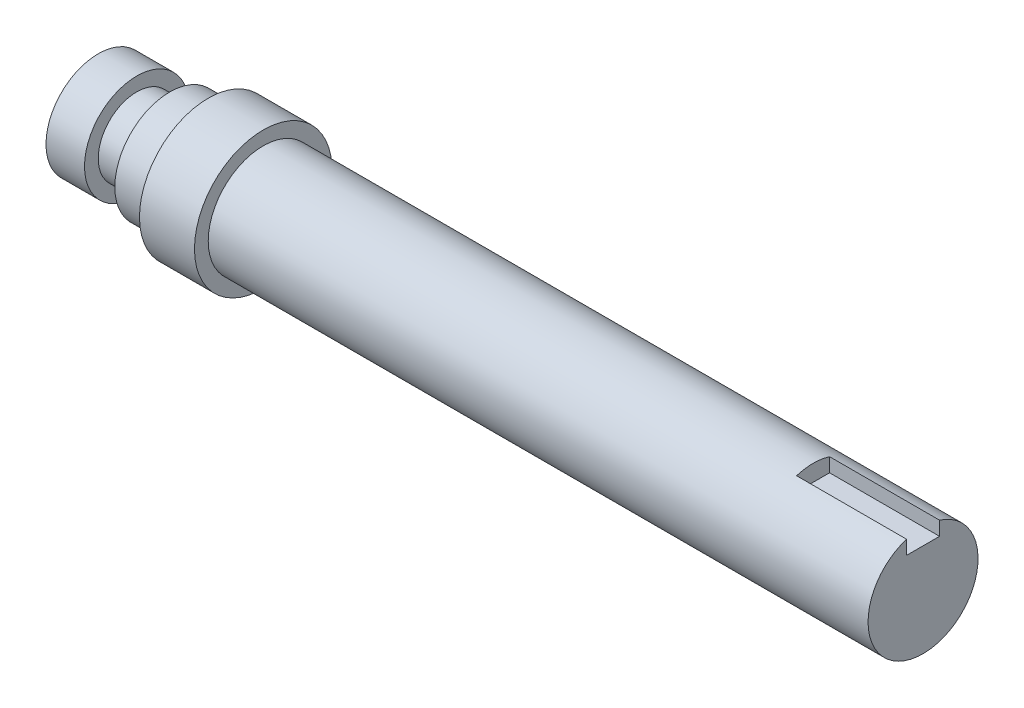
ISO-10303-21;
HEADER;
FILE_DESCRIPTION(('STEP AP214'),'2;1');
FILE_NAME('part.step','',(''),(''),'','','');
FILE_SCHEMA(('AUTOMOTIVE_DESIGN { 1 0 10303 214 1 1 1 1 }'));
ENDSEC;
DATA;
#1=APPLICATION_CONTEXT('core data for automotive mechanical design processes');
#2=APPLICATION_PROTOCOL_DEFINITION('international standard','automotive_design',2000,#1);
#3=PRODUCT_CONTEXT('',#1,'mechanical');
#4=PRODUCT('Part','Part','',(#3));
#5=PRODUCT_RELATED_PRODUCT_CATEGORY('part','',(#4));
#6=PRODUCT_DEFINITION_FORMATION('','',#4);
#7=PRODUCT_DEFINITION_CONTEXT('part definition',#1,'design');
#8=PRODUCT_DEFINITION('design','',#6,#7);
#9=PRODUCT_DEFINITION_SHAPE('','',#8);
#10=(LENGTH_UNIT() NAMED_UNIT(*) SI_UNIT(.MILLI.,.METRE.));
#11=(NAMED_UNIT(*) PLANE_ANGLE_UNIT() SI_UNIT($,.RADIAN.));
#12=(NAMED_UNIT(*) SI_UNIT($,.STERADIAN.) SOLID_ANGLE_UNIT());
#13=UNCERTAINTY_MEASURE_WITH_UNIT(LENGTH_MEASURE(1.E-05),#10,'distance_accuracy_value','');
#14=(GEOMETRIC_REPRESENTATION_CONTEXT(3) GLOBAL_UNCERTAINTY_ASSIGNED_CONTEXT((#13)) GLOBAL_UNIT_ASSIGNED_CONTEXT((#10,
#11,#12)) REPRESENTATION_CONTEXT('',''));
#15=CARTESIAN_POINT('',(0.,0.,0.));
#16=DIRECTION('',(0.,0.,1.));
#17=DIRECTION('',(1.,0.,0.));
#18=AXIS2_PLACEMENT_3D('',#15,#16,#17);
#19=CARTESIAN_POINT('',(0.,0.,0.));
#20=DIRECTION('',(-1.,0.,0.));
#21=DIRECTION('',(0.,0.,1.));
#22=AXIS2_PLACEMENT_3D('',#19,#20,#21);
#23=PLANE('',#22);
#24=CARTESIAN_POINT('',(0.,0.,0.));
#25=DIRECTION('',(-1.,0.,0.));
#26=DIRECTION('',(0.,0.,1.));
#27=AXIS2_PLACEMENT_3D('',#24,#25,#26);
#28=CIRCLE('',#27,10.);
#29=CARTESIAN_POINT('',(0.,9.53939201416945,-3.));
#30=VERTEX_POINT('',#29);
#31=CARTESIAN_POINT('',(0.,9.53939201416945,3.));
#32=VERTEX_POINT('',#31);
#33=EDGE_CURVE('E129',#30,#32,#28,.T.);
#34=ORIENTED_EDGE('',*,*,#33,.F.);
#35=DIRECTION('',(0.,1.,0.));
#36=VECTOR('',#35,1.);
#37=CARTESIAN_POINT('',(0.,12.,-3.));
#38=LINE('',#37,#36);
#39=CARTESIAN_POINT('',(0.,7.,-3.));
#40=VERTEX_POINT('',#39);
#41=EDGE_CURVE('E59',#40,#30,#38,.T.);
#42=ORIENTED_EDGE('',*,*,#41,.F.);
#43=DIRECTION('',(0.,0.,1.));
#44=VECTOR('',#43,1.);
#45=CARTESIAN_POINT('',(0.,7.,-3.));
#46=LINE('',#45,#44);
#47=CARTESIAN_POINT('',(0.,7.,3.));
#48=VERTEX_POINT('',#47);
#49=EDGE_CURVE('E89',#40,#48,#46,.T.);
#50=ORIENTED_EDGE('',*,*,#49,.T.);
#51=DIRECTION('',(0.,1.,0.));
#52=VECTOR('',#51,1.);
#53=CARTESIAN_POINT('',(0.,12.,3.));
#54=LINE('',#53,#52);
#55=EDGE_CURVE('E82',#48,#32,#54,.T.);
#56=ORIENTED_EDGE('',*,*,#55,.T.);
#57=EDGE_LOOP('',(#34,#42,#50,#56));
#58=FACE_BOUND('',#57,.T.);
#59=ADVANCED_FACE('F37',(#58),#23,.F.);
#60=CARTESIAN_POINT('',(-150.,0.,0.));
#61=DIRECTION('',(-1.,0.,0.));
#62=DIRECTION('',(0.,0.,1.));
#63=AXIS2_PLACEMENT_3D('',#60,#61,#62);
#64=CYLINDRICAL_SURFACE('',#63,9.99999999999999);
#65=CARTESIAN_POINT('',(-120.,0.,0.));
#66=DIRECTION('',(-1.,0.,0.));
#67=DIRECTION('',(0.,0.,1.));
#68=AXIS2_PLACEMENT_3D('',#65,#66,#67);
#69=CIRCLE('',#68,9.99999999999999);
#70=CARTESIAN_POINT('',(-120.,0.,9.99999999999999));
#71=VERTEX_POINT('',#70);
#72=EDGE_CURVE('E126',#71,#71,#69,.T.);
#73=ORIENTED_EDGE('',*,*,#72,.F.);
#74=EDGE_LOOP('',(#73));
#75=FACE_BOUND('',#74,.T.);
#76=CARTESIAN_POINT('',(-20.,0.,0.));
#77=DIRECTION('',(-1.,0.,0.));
#78=DIRECTION('',(0.,0.,1.));
#79=AXIS2_PLACEMENT_3D('',#76,#77,#78);
#80=CIRCLE('',#79,9.99999999999999);
#81=CARTESIAN_POINT('',(-20.,9.53939201416945,3.));
#82=VERTEX_POINT('',#81);
#83=CARTESIAN_POINT('',(-20.,9.53939201416945,-3.));
#84=VERTEX_POINT('',#83);
#85=EDGE_CURVE('E44',#82,#84,#80,.T.);
#86=ORIENTED_EDGE('',*,*,#85,.T.);
#87=DIRECTION('',(-1.,0.,0.));
#88=VECTOR('',#87,1.);
#89=CARTESIAN_POINT('',(-150.,9.53939201416945,-3.));
#90=LINE('',#89,#88);
#91=EDGE_CURVE('E11',#84,#30,#90,.F.);
#92=ORIENTED_EDGE('',*,*,#91,.T.);
#93=ORIENTED_EDGE('',*,*,#33,.T.);
#94=DIRECTION('',(-1.,0.,0.));
#95=VECTOR('',#94,1.);
#96=CARTESIAN_POINT('',(-150.,9.53939201416945,3.));
#97=LINE('',#96,#95);
#98=EDGE_CURVE('E132',#82,#32,#97,.F.);
#99=ORIENTED_EDGE('',*,*,#98,.F.);
#100=EDGE_LOOP('',(#86,#92,#93,#99));
#101=FACE_BOUND('',#100,.T.);
#102=ADVANCED_FACE('F135',(#75,#101),#64,.T.);
#103=CARTESIAN_POINT('',(-120.,9.99999999999999,0.));
#104=DIRECTION('',(-1.,0.,0.));
#105=DIRECTION('',(0.,0.,1.));
#106=AXIS2_PLACEMENT_3D('',#103,#104,#105);
#107=PLANE('',#106);
#108=CARTESIAN_POINT('',(-120.,0.,0.));
#109=DIRECTION('',(-1.,0.,0.));
#110=DIRECTION('',(0.,0.,1.));
#111=AXIS2_PLACEMENT_3D('',#108,#109,#110);
#112=CIRCLE('',#111,12.5);
#113=CARTESIAN_POINT('',(-120.,0.,12.5));
#114=VERTEX_POINT('',#113);
#115=EDGE_CURVE('E123',#114,#114,#112,.T.);
#116=ORIENTED_EDGE('',*,*,#115,.F.);
#117=EDGE_LOOP('',(#116));
#118=FACE_BOUND('',#117,.T.);
#119=ORIENTED_EDGE('',*,*,#72,.T.);
#120=EDGE_LOOP('',(#119));
#121=FACE_BOUND('',#120,.T.);
#122=ADVANCED_FACE('F143',(#118,#121),#107,.F.);
#123=CARTESIAN_POINT('',(-150.,0.,0.));
#124=DIRECTION('',(-1.,0.,0.));
#125=DIRECTION('',(0.,0.,1.));
#126=AXIS2_PLACEMENT_3D('',#123,#124,#125);
#127=CYLINDRICAL_SURFACE('',#126,12.5);
#128=CARTESIAN_POINT('',(-130.,0.,0.));
#129=DIRECTION('',(-1.,0.,0.));
#130=DIRECTION('',(0.,0.,1.));
#131=AXIS2_PLACEMENT_3D('',#128,#129,#130);
#132=CIRCLE('',#131,12.5);
#133=CARTESIAN_POINT('',(-130.,0.,12.5));
#134=VERTEX_POINT('',#133);
#135=EDGE_CURVE('E120',#134,#134,#132,.T.);
#136=ORIENTED_EDGE('',*,*,#135,.F.);
#137=EDGE_LOOP('',(#136));
#138=FACE_BOUND('',#137,.T.);
#139=ORIENTED_EDGE('',*,*,#115,.T.);
#140=EDGE_LOOP('',(#139));
#141=FACE_BOUND('',#140,.T.);
#142=ADVANCED_FACE('F148',(#138,#141),#127,.T.);
#143=CARTESIAN_POINT('',(-130.,12.5,0.));
#144=DIRECTION('',(1.,0.,0.));
#145=DIRECTION('',(0.,0.,-1.));
#146=AXIS2_PLACEMENT_3D('',#143,#144,#145);
#147=PLANE('',#146);
#148=CARTESIAN_POINT('',(-130.,0.,0.));
#149=DIRECTION('',(-1.,0.,0.));
#150=DIRECTION('',(0.,0.,1.));
#151=AXIS2_PLACEMENT_3D('',#148,#149,#150);
#152=CIRCLE('',#151,9.97959183673467);
#153=CARTESIAN_POINT('',(-130.,0.,9.97959183673467));
#154=VERTEX_POINT('',#153);
#155=EDGE_CURVE('E117',#154,#154,#152,.T.);
#156=ORIENTED_EDGE('',*,*,#155,.F.);
#157=EDGE_LOOP('',(#156));
#158=FACE_BOUND('',#157,.T.);
#159=ORIENTED_EDGE('',*,*,#135,.T.);
#160=EDGE_LOOP('',(#159));
#161=FACE_BOUND('',#160,.T.);
#162=ADVANCED_FACE('F155',(#158,#161),#147,.F.);
#163=CARTESIAN_POINT('',(-150.,0.,0.));
#164=DIRECTION('',(-1.,0.,0.));
#165=DIRECTION('',(0.,0.,1.));
#166=AXIS2_PLACEMENT_3D('',#163,#164,#165);
#167=CYLINDRICAL_SURFACE('',#166,9.97959183673467);
#168=CARTESIAN_POINT('',(-137.,0.,0.));
#169=DIRECTION('',(-1.,0.,0.));
#170=DIRECTION('',(0.,0.,1.));
#171=AXIS2_PLACEMENT_3D('',#168,#169,#170);
#172=CIRCLE('',#171,9.97959183673467);
#173=CARTESIAN_POINT('',(-137.,0.,9.97959183673467));
#174=VERTEX_POINT('',#173);
#175=EDGE_CURVE('E114',#174,#174,#172,.T.);
#176=ORIENTED_EDGE('',*,*,#175,.F.);
#177=EDGE_LOOP('',(#176));
#178=FACE_BOUND('',#177,.T.);
#179=ORIENTED_EDGE('',*,*,#155,.T.);
#180=EDGE_LOOP('',(#179));
#181=FACE_BOUND('',#180,.T.);
#182=ADVANCED_FACE('F159',(#178,#181),#167,.T.);
#183=CARTESIAN_POINT('',(-137.,9.97959183673467,0.));
#184=DIRECTION('',(1.,0.,0.));
#185=DIRECTION('',(0.,0.,-1.));
#186=AXIS2_PLACEMENT_3D('',#183,#184,#185);
#187=PLANE('',#186);
#188=CARTESIAN_POINT('',(-137.,0.,0.));
#189=DIRECTION('',(-1.,0.,0.));
#190=DIRECTION('',(0.,0.,1.));
#191=AXIS2_PLACEMENT_3D('',#188,#189,#190);
#192=CIRCLE('',#191,6.99999999999998);
#193=CARTESIAN_POINT('',(-137.,0.,6.99999999999998));
#194=VERTEX_POINT('',#193);
#195=EDGE_CURVE('E111',#194,#194,#192,.T.);
#196=ORIENTED_EDGE('',*,*,#195,.F.);
#197=EDGE_LOOP('',(#196));
#198=FACE_BOUND('',#197,.T.);
#199=ORIENTED_EDGE('',*,*,#175,.T.);
#200=EDGE_LOOP('',(#199));
#201=FACE_BOUND('',#200,.T.);
#202=ADVANCED_FACE('F163',(#198,#201),#187,.F.);
#203=CARTESIAN_POINT('',(-150.,0.,0.));
#204=DIRECTION('',(-1.,0.,0.));
#205=DIRECTION('',(0.,0.,1.));
#206=AXIS2_PLACEMENT_3D('',#203,#204,#205);
#207=CYLINDRICAL_SURFACE('',#206,6.99999999999998);
#208=CARTESIAN_POINT('',(-143.,0.,0.));
#209=DIRECTION('',(-1.,0.,0.));
#210=DIRECTION('',(0.,0.,1.));
#211=AXIS2_PLACEMENT_3D('',#208,#209,#210);
#212=CIRCLE('',#211,6.99999999999998);
#213=CARTESIAN_POINT('',(-143.,0.,6.99999999999998));
#214=VERTEX_POINT('',#213);
#215=EDGE_CURVE('E108',#214,#214,#212,.T.);
#216=ORIENTED_EDGE('',*,*,#215,.F.);
#217=EDGE_LOOP('',(#216));
#218=FACE_BOUND('',#217,.T.);
#219=ORIENTED_EDGE('',*,*,#195,.T.);
#220=EDGE_LOOP('',(#219));
#221=FACE_BOUND('',#220,.T.);
#222=ADVANCED_FACE('F167',(#218,#221),#207,.T.);
#223=CARTESIAN_POINT('',(-143.,6.99999999999998,0.));
#224=DIRECTION('',(-1.,0.,0.));
#225=DIRECTION('',(0.,0.,1.));
#226=AXIS2_PLACEMENT_3D('',#223,#224,#225);
#227=PLANE('',#226);
#228=CARTESIAN_POINT('',(-143.,0.,0.));
#229=DIRECTION('',(-1.,0.,0.));
#230=DIRECTION('',(0.,0.,1.));
#231=AXIS2_PLACEMENT_3D('',#228,#229,#230);
#232=CIRCLE('',#231,9.5);
#233=CARTESIAN_POINT('',(-143.,0.,9.5));
#234=VERTEX_POINT('',#233);
#235=EDGE_CURVE('E105',#234,#234,#232,.T.);
#236=ORIENTED_EDGE('',*,*,#235,.F.);
#237=EDGE_LOOP('',(#236));
#238=FACE_BOUND('',#237,.T.);
#239=ORIENTED_EDGE('',*,*,#215,.T.);
#240=EDGE_LOOP('',(#239));
#241=FACE_BOUND('',#240,.T.);
#242=ADVANCED_FACE('F171',(#238,#241),#227,.F.);
#243=CARTESIAN_POINT('',(-150.,0.,0.));
#244=DIRECTION('',(-1.,0.,0.));
#245=DIRECTION('',(0.,0.,1.));
#246=AXIS2_PLACEMENT_3D('',#243,#244,#245);
#247=CYLINDRICAL_SURFACE('',#246,9.5);
#248=CARTESIAN_POINT('',(-150.,0.,0.));
#249=DIRECTION('',(-1.,0.,0.));
#250=DIRECTION('',(0.,0.,1.));
#251=AXIS2_PLACEMENT_3D('',#248,#249,#250);
#252=CIRCLE('',#251,9.5);
#253=CARTESIAN_POINT('',(-150.,0.,9.5));
#254=VERTEX_POINT('',#253);
#255=EDGE_CURVE('E101',#254,#254,#252,.T.);
#256=ORIENTED_EDGE('',*,*,#255,.F.);
#257=EDGE_LOOP('',(#256));
#258=FACE_BOUND('',#257,.T.);
#259=ORIENTED_EDGE('',*,*,#235,.T.);
#260=EDGE_LOOP('',(#259));
#261=FACE_BOUND('',#260,.T.);
#262=ADVANCED_FACE('F175',(#258,#261),#247,.T.);
#263=CARTESIAN_POINT('',(-150.,9.5,0.));
#264=DIRECTION('',(1.,0.,0.));
#265=DIRECTION('',(0.,0.,-1.));
#266=AXIS2_PLACEMENT_3D('',#263,#264,#265);
#267=PLANE('',#266);
#268=ORIENTED_EDGE('',*,*,#255,.T.);
#269=EDGE_LOOP('',(#268));
#270=FACE_BOUND('',#269,.T.);
#271=ADVANCED_FACE('F179',(#270),#267,.F.);
#272=CARTESIAN_POINT('',(-20.,12.,-3.));
#273=DIRECTION('',(-1.,0.,0.));
#274=DIRECTION('',(0.,0.,1.));
#275=AXIS2_PLACEMENT_3D('',#272,#273,#274);
#276=PLANE('',#275);
#277=DIRECTION('',(0.,-1.,0.));
#278=VECTOR('',#277,1.);
#279=CARTESIAN_POINT('',(-20.,12.,3.));
#280=LINE('',#279,#278);
#281=CARTESIAN_POINT('',(-20.,7.,3.));
#282=VERTEX_POINT('',#281);
#283=EDGE_CURVE('E51',#82,#282,#280,.T.);
#284=ORIENTED_EDGE('',*,*,#283,.T.);
#285=DIRECTION('',(0.,0.,1.));
#286=VECTOR('',#285,1.);
#287=CARTESIAN_POINT('',(-20.,7.,-3.));
#288=LINE('',#287,#286);
#289=CARTESIAN_POINT('',(-20.,7.,-3.));
#290=VERTEX_POINT('',#289);
#291=EDGE_CURVE('E85',#290,#282,#288,.T.);
#292=ORIENTED_EDGE('',*,*,#291,.F.);
#293=DIRECTION('',(0.,-1.,0.));
#294=VECTOR('',#293,1.);
#295=CARTESIAN_POINT('',(-20.,12.,-3.));
#296=LINE('',#295,#294);
#297=EDGE_CURVE('E75',#84,#290,#296,.T.);
#298=ORIENTED_EDGE('',*,*,#297,.F.);
#299=ORIENTED_EDGE('',*,*,#85,.F.);
#300=EDGE_LOOP('',(#284,#292,#298,#299));
#301=FACE_BOUND('',#300,.T.);
#302=ADVANCED_FACE('F86',(#301),#276,.F.);
#303=CARTESIAN_POINT('',(0.,0.,-3.));
#304=DIRECTION('',(0.,0.,-1.));
#305=DIRECTION('',(-1.,0.,0.));
#306=AXIS2_PLACEMENT_3D('',#303,#304,#305);
#307=PLANE('',#306);
#308=ORIENTED_EDGE('',*,*,#297,.T.);
#309=DIRECTION('',(1.,0.,0.));
#310=VECTOR('',#309,1.);
#311=CARTESIAN_POINT('',(0.,7.,-3.));
#312=LINE('',#311,#310);
#313=EDGE_CURVE('E79',#290,#40,#312,.T.);
#314=ORIENTED_EDGE('',*,*,#313,.T.);
#315=ORIENTED_EDGE('',*,*,#41,.T.);
#316=ORIENTED_EDGE('',*,*,#91,.F.);
#317=EDGE_LOOP('',(#308,#314,#315,#316));
#318=FACE_BOUND('',#317,.T.);
#319=ADVANCED_FACE('F77',(#318),#307,.F.);
#320=CARTESIAN_POINT('',(0.,0.,3.));
#321=DIRECTION('',(0.,0.,-1.));
#322=DIRECTION('',(-1.,0.,0.));
#323=AXIS2_PLACEMENT_3D('',#320,#321,#322);
#324=PLANE('',#323);
#325=ORIENTED_EDGE('',*,*,#98,.T.);
#326=ORIENTED_EDGE('',*,*,#55,.F.);
#327=DIRECTION('',(1.,0.,0.));
#328=VECTOR('',#327,1.);
#329=CARTESIAN_POINT('',(0.,7.,3.));
#330=LINE('',#329,#328);
#331=EDGE_CURVE('E97',#282,#48,#330,.T.);
#332=ORIENTED_EDGE('',*,*,#331,.F.);
#333=ORIENTED_EDGE('',*,*,#283,.F.);
#334=EDGE_LOOP('',(#325,#326,#332,#333));
#335=FACE_BOUND('',#334,.T.);
#336=ADVANCED_FACE('F137',(#335),#324,.T.);
#337=CARTESIAN_POINT('',(0.,7.,-3.));
#338=DIRECTION('',(0.,-1.,0.));
#339=DIRECTION('',(0.,0.,-1.));
#340=AXIS2_PLACEMENT_3D('',#337,#338,#339);
#341=PLANE('',#340);
#342=ORIENTED_EDGE('',*,*,#331,.T.);
#343=ORIENTED_EDGE('',*,*,#49,.F.);
#344=ORIENTED_EDGE('',*,*,#313,.F.);
#345=ORIENTED_EDGE('',*,*,#291,.T.);
#346=EDGE_LOOP('',(#342,#343,#344,#345));
#347=FACE_BOUND('',#346,.T.);
#348=ADVANCED_FACE('F91',(#347),#341,.F.);
#349=CLOSED_SHELL('',(#59,#102,#122,#142,#162,#182,#202,#222,#242,#262,#271,#302,#319,#336,#348));
#350=MANIFOLD_SOLID_BREP('B2',#349);
#351=ADVANCED_BREP_SHAPE_REPRESENTATION('',(#18,#350),#14);
#352=SHAPE_DEFINITION_REPRESENTATION(#9,#351);
ENDSEC;
END-ISO-10303-21;
